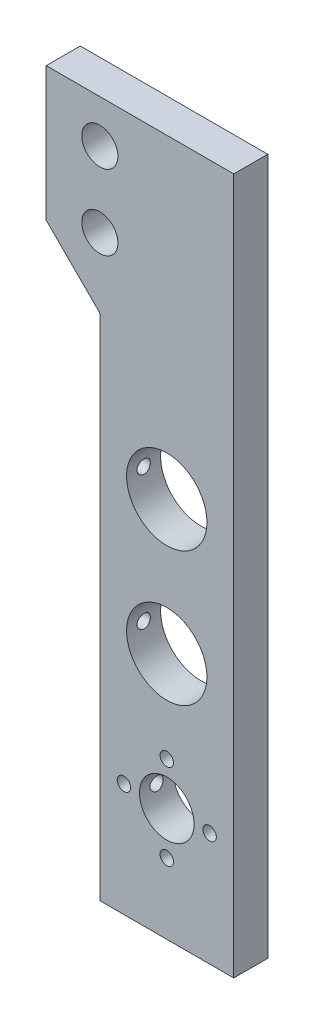
ISO-10303-21;
HEADER;
FILE_DESCRIPTION(('STEP AP214'),'2;1');
FILE_NAME('part.step','',(''),(''),'','','');
FILE_SCHEMA(('AUTOMOTIVE_DESIGN { 1 0 10303 214 1 1 1 1 }'));
ENDSEC;
DATA;
#1=APPLICATION_CONTEXT('core data for automotive mechanical design processes');
#2=APPLICATION_PROTOCOL_DEFINITION('international standard','automotive_design',2000,#1);
#3=PRODUCT_CONTEXT('',#1,'mechanical');
#4=PRODUCT('Part','Part','',(#3));
#5=PRODUCT_RELATED_PRODUCT_CATEGORY('part','',(#4));
#6=PRODUCT_DEFINITION_FORMATION('','',#4);
#7=PRODUCT_DEFINITION_CONTEXT('part definition',#1,'design');
#8=PRODUCT_DEFINITION('design','',#6,#7);
#9=PRODUCT_DEFINITION_SHAPE('','',#8);
#10=(LENGTH_UNIT() NAMED_UNIT(*) SI_UNIT(.MILLI.,.METRE.));
#11=(NAMED_UNIT(*) PLANE_ANGLE_UNIT() SI_UNIT($,.RADIAN.));
#12=(NAMED_UNIT(*) SI_UNIT($,.STERADIAN.) SOLID_ANGLE_UNIT());
#13=UNCERTAINTY_MEASURE_WITH_UNIT(LENGTH_MEASURE(1.E-05),#10,'distance_accuracy_value','');
#14=(GEOMETRIC_REPRESENTATION_CONTEXT(3) GLOBAL_UNCERTAINTY_ASSIGNED_CONTEXT((#13)) GLOBAL_UNIT_ASSIGNED_CONTEXT((#10,
#11,#12)) REPRESENTATION_CONTEXT('',''));
#15=CARTESIAN_POINT('',(0.,0.,0.));
#16=DIRECTION('',(0.,0.,1.));
#17=DIRECTION('',(1.,0.,0.));
#18=AXIS2_PLACEMENT_3D('',#15,#16,#17);
#19=CARTESIAN_POINT('',(0.,0.,6.35));
#20=DIRECTION('',(0.,0.,-1.));
#21=DIRECTION('',(-1.,0.,0.));
#22=AXIS2_PLACEMENT_3D('',#19,#20,#21);
#23=PLANE('',#22);
#24=CARTESIAN_POINT('',(0.,8.,6.35));
#25=DIRECTION('',(0.,0.,1.));
#26=DIRECTION('',(1.,0.,0.));
#27=AXIS2_PLACEMENT_3D('',#24,#25,#26);
#28=CIRCLE('',#27,1.25);
#29=CARTESIAN_POINT('',(1.25,8.,6.35));
#30=VERTEX_POINT('',#29);
#31=EDGE_CURVE('E303',#30,#30,#28,.T.);
#32=ORIENTED_EDGE('',*,*,#31,.F.);
#33=EDGE_LOOP('',(#32));
#34=FACE_BOUND('',#33,.T.);
#35=CARTESIAN_POINT('',(8.,0.,6.35));
#36=DIRECTION('',(0.,0.,1.));
#37=DIRECTION('',(1.,0.,0.));
#38=AXIS2_PLACEMENT_3D('',#35,#36,#37);
#39=CIRCLE('',#38,1.25);
#40=CARTESIAN_POINT('',(9.25,0.,6.35));
#41=VERTEX_POINT('',#40);
#42=EDGE_CURVE('E295',#41,#41,#39,.T.);
#43=ORIENTED_EDGE('',*,*,#42,.F.);
#44=EDGE_LOOP('',(#43));
#45=FACE_BOUND('',#44,.T.);
#46=CARTESIAN_POINT('',(0.,-8.,6.35));
#47=DIRECTION('',(0.,0.,1.));
#48=DIRECTION('',(1.,0.,0.));
#49=AXIS2_PLACEMENT_3D('',#46,#47,#48);
#50=CIRCLE('',#49,1.25);
#51=CARTESIAN_POINT('',(1.25,-8.,6.35));
#52=VERTEX_POINT('',#51);
#53=EDGE_CURVE('E287',#52,#52,#50,.T.);
#54=ORIENTED_EDGE('',*,*,#53,.F.);
#55=EDGE_LOOP('',(#54));
#56=FACE_BOUND('',#55,.T.);
#57=CARTESIAN_POINT('',(-12.5,86.85,6.35));
#58=DIRECTION('',(0.,0.,1.));
#59=DIRECTION('',(1.,0.,0.));
#60=AXIS2_PLACEMENT_3D('',#57,#58,#59);
#61=CIRCLE('',#60,3.3782);
#62=CARTESIAN_POINT('',(-9.1218,86.85,6.35));
#63=VERTEX_POINT('',#62);
#64=EDGE_CURVE('E271',#63,#63,#61,.T.);
#65=ORIENTED_EDGE('',*,*,#64,.F.);
#66=EDGE_LOOP('',(#65));
#67=FACE_BOUND('',#66,.T.);
#68=DIRECTION('',(-1.,0.,0.));
#69=VECTOR('',#68,1.);
#70=CARTESIAN_POINT('',(-12.5,108.85,6.35));
#71=LINE('',#70,#69);
#72=CARTESIAN_POINT('',(12.5,108.85,6.35));
#73=VERTEX_POINT('',#72);
#74=CARTESIAN_POINT('',(-22.5,108.85,6.35));
#75=VERTEX_POINT('',#74);
#76=EDGE_CURVE('E181',#73,#75,#71,.T.);
#77=ORIENTED_EDGE('',*,*,#76,.T.);
#78=DIRECTION('',(0.,-1.,0.));
#79=VECTOR('',#78,1.);
#80=CARTESIAN_POINT('',(-22.5,83.8500000000001,6.35));
#81=LINE('',#80,#79);
#82=CARTESIAN_POINT('',(-22.5,83.8500000000001,6.35));
#83=VERTEX_POINT('',#82);
#84=EDGE_CURVE('E240',#75,#83,#81,.T.);
#85=ORIENTED_EDGE('',*,*,#84,.T.);
#86=DIRECTION('',(0.707106781186543,-0.707106781186552,0.));
#87=VECTOR('',#86,1.);
#88=CARTESIAN_POINT('',(-12.5,73.85,6.35));
#89=LINE('',#88,#87);
#90=CARTESIAN_POINT('',(-12.5,73.85,6.35));
#91=VERTEX_POINT('',#90);
#92=EDGE_CURVE('E237',#83,#91,#89,.T.);
#93=ORIENTED_EDGE('',*,*,#92,.T.);
#94=DIRECTION('',(0.,-1.,0.));
#95=VECTOR('',#94,1.);
#96=CARTESIAN_POINT('',(-12.5,-21.15,6.35));
#97=LINE('',#96,#95);
#98=CARTESIAN_POINT('',(-12.5,-21.15,6.35));
#99=VERTEX_POINT('',#98);
#100=EDGE_CURVE('E185',#91,#99,#97,.T.);
#101=ORIENTED_EDGE('',*,*,#100,.T.);
#102=DIRECTION('',(1.,0.,0.));
#103=VECTOR('',#102,1.);
#104=CARTESIAN_POINT('',(-12.5,-21.15,6.35));
#105=LINE('',#104,#103);
#106=CARTESIAN_POINT('',(12.5,-21.15,6.35));
#107=VERTEX_POINT('',#106);
#108=EDGE_CURVE('E201',#99,#107,#105,.T.);
#109=ORIENTED_EDGE('',*,*,#108,.T.);
#110=DIRECTION('',(0.,1.,0.));
#111=VECTOR('',#110,1.);
#112=CARTESIAN_POINT('',(12.5,-21.15,6.35));
#113=LINE('',#112,#111);
#114=EDGE_CURVE('E198',#107,#73,#113,.T.);
#115=ORIENTED_EDGE('',*,*,#114,.T.);
#116=EDGE_LOOP('',(#77,#85,#93,#101,#109,#115));
#117=FACE_BOUND('',#116,.T.);
#118=CARTESIAN_POINT('',(0.,0.,6.35));
#119=DIRECTION('',(0.,0.,1.));
#120=DIRECTION('',(1.,0.,0.));
#121=AXIS2_PLACEMENT_3D('',#118,#119,#120);
#122=CIRCLE('',#121,5.1);
#123=CARTESIAN_POINT('',(5.1,0.,6.35));
#124=VERTEX_POINT('',#123);
#125=EDGE_CURVE('E195',#124,#124,#122,.T.);
#126=ORIENTED_EDGE('',*,*,#125,.F.);
#127=EDGE_LOOP('',(#126));
#128=FACE_BOUND('',#127,.T.);
#129=CARTESIAN_POINT('',(0.,25.,6.35));
#130=DIRECTION('',(0.,0.,1.));
#131=DIRECTION('',(1.,0.,0.));
#132=AXIS2_PLACEMENT_3D('',#129,#130,#131);
#133=CIRCLE('',#132,7.5);
#134=CARTESIAN_POINT('',(7.5,25.,6.35));
#135=VERTEX_POINT('',#134);
#136=EDGE_CURVE('E210',#135,#135,#133,.T.);
#137=ORIENTED_EDGE('',*,*,#136,.F.);
#138=EDGE_LOOP('',(#137));
#139=FACE_BOUND('',#138,.T.);
#140=CARTESIAN_POINT('',(0.,50.,6.35));
#141=DIRECTION('',(0.,0.,1.));
#142=DIRECTION('',(1.,0.,0.));
#143=AXIS2_PLACEMENT_3D('',#140,#141,#142);
#144=CIRCLE('',#143,7.5);
#145=CARTESIAN_POINT('',(7.5,50.,6.35));
#146=VERTEX_POINT('',#145);
#147=EDGE_CURVE('E218',#146,#146,#144,.T.);
#148=ORIENTED_EDGE('',*,*,#147,.F.);
#149=EDGE_LOOP('',(#148));
#150=FACE_BOUND('',#149,.T.);
#151=CARTESIAN_POINT('',(-12.5,100.85,6.35));
#152=DIRECTION('',(0.,0.,1.));
#153=DIRECTION('',(1.,0.,0.));
#154=AXIS2_PLACEMENT_3D('',#151,#152,#153);
#155=CIRCLE('',#154,3.3782);
#156=CARTESIAN_POINT('',(-9.1218,100.85,6.35));
#157=VERTEX_POINT('',#156);
#158=EDGE_CURVE('E263',#157,#157,#155,.T.);
#159=ORIENTED_EDGE('',*,*,#158,.F.);
#160=EDGE_LOOP('',(#159));
#161=FACE_BOUND('',#160,.T.);
#162=CARTESIAN_POINT('',(-8.,0.,6.35));
#163=DIRECTION('',(0.,0.,1.));
#164=DIRECTION('',(1.,0.,0.));
#165=AXIS2_PLACEMENT_3D('',#162,#163,#164);
#166=CIRCLE('',#165,1.25);
#167=CARTESIAN_POINT('',(-6.75,0.,6.35));
#168=VERTEX_POINT('',#167);
#169=EDGE_CURVE('E279',#168,#168,#166,.T.);
#170=ORIENTED_EDGE('',*,*,#169,.F.);
#171=EDGE_LOOP('',(#170));
#172=FACE_BOUND('',#171,.T.);
#173=ADVANCED_FACE('F45',(#34,#45,#56,#67,#117,#128,#139,#150,#161,#172),#23,.F.);
#174=CARTESIAN_POINT('',(-12.5,0.,3.175));
#175=DIRECTION('',(-1.,0.,0.));
#176=DIRECTION('',(0.,0.,1.));
#177=AXIS2_PLACEMENT_3D('',#174,#175,#176);
#178=CYLINDRICAL_SURFACE('',#177,1.24999999999999);
#179=CARTESIAN_POINT('',(-12.5,0.,3.175));
#180=DIRECTION('',(-1.,0.,0.));
#181=DIRECTION('',(0.,0.,1.));
#182=AXIS2_PLACEMENT_3D('',#179,#180,#181);
#183=CIRCLE('',#182,1.24999999999999);
#184=CARTESIAN_POINT('',(-12.5,0.,4.42499999999999));
#185=VERTEX_POINT('',#184);
#186=EDGE_CURVE('E132',#185,#185,#183,.T.);
#187=ORIENTED_EDGE('',*,*,#186,.T.);
#188=EDGE_LOOP('',(#187));
#189=FACE_BOUND('',#188,.T.);
#190=CARTESIAN_POINT('',(-8.,0.,3.175));
#191=DIRECTION('',(-0.707106781186547,0.,-0.707106781186547));
#192=DIRECTION('',(-0.707106781186547,0.,0.707106781186547));
#193=AXIS2_PLACEMENT_3D('',#190,#191,#192);
#194=ELLIPSE('',#193,1.76776695296636,1.25);
#195=CARTESIAN_POINT('',(-8.,1.25,3.175));
#196=VERTEX_POINT('',#195);
#197=CARTESIAN_POINT('',(-8.,-1.25,3.175));
#198=VERTEX_POINT('',#197);
#199=EDGE_CURVE('E59',#196,#198,#194,.F.);
#200=ORIENTED_EDGE('',*,*,#199,.T.);
#201=CARTESIAN_POINT('',(-8.,0.,3.175));
#202=DIRECTION('',(-0.707106781186547,0.,0.707106781186547));
#203=DIRECTION('',(-0.707106781186547,0.,-0.707106781186547));
#204=AXIS2_PLACEMENT_3D('',#201,#202,#203);
#205=ELLIPSE('',#204,1.76776695296636,1.25);
#206=EDGE_CURVE('E11',#198,#196,#205,.F.);
#207=ORIENTED_EDGE('',*,*,#206,.T.);
#208=EDGE_LOOP('',(#200,#207));
#209=FACE_BOUND('',#208,.T.);
#210=ADVANCED_FACE('F117',(#189,#209),#178,.F.);
#211=CARTESIAN_POINT('',(0.,0.,0.));
#212=DIRECTION('',(0.,0.,-1.));
#213=DIRECTION('',(-1.,0.,0.));
#214=AXIS2_PLACEMENT_3D('',#211,#212,#213);
#215=PLANE('',#214);
#216=CARTESIAN_POINT('',(0.,8.,0.));
#217=DIRECTION('',(0.,0.,1.));
#218=DIRECTION('',(1.,0.,0.));
#219=AXIS2_PLACEMENT_3D('',#216,#217,#218);
#220=CIRCLE('',#219,1.25);
#221=CARTESIAN_POINT('',(1.25,8.,0.));
#222=VERTEX_POINT('',#221);
#223=EDGE_CURVE('E299',#222,#222,#220,.T.);
#224=ORIENTED_EDGE('',*,*,#223,.T.);
#225=EDGE_LOOP('',(#224));
#226=FACE_BOUND('',#225,.T.);
#227=CARTESIAN_POINT('',(8.,0.,0.));
#228=DIRECTION('',(0.,0.,1.));
#229=DIRECTION('',(1.,0.,0.));
#230=AXIS2_PLACEMENT_3D('',#227,#228,#229);
#231=CIRCLE('',#230,1.25);
#232=CARTESIAN_POINT('',(9.25,0.,0.));
#233=VERTEX_POINT('',#232);
#234=EDGE_CURVE('E291',#233,#233,#231,.T.);
#235=ORIENTED_EDGE('',*,*,#234,.T.);
#236=EDGE_LOOP('',(#235));
#237=FACE_BOUND('',#236,.T.);
#238=CARTESIAN_POINT('',(0.,-8.,0.));
#239=DIRECTION('',(0.,0.,1.));
#240=DIRECTION('',(1.,0.,0.));
#241=AXIS2_PLACEMENT_3D('',#238,#239,#240);
#242=CIRCLE('',#241,1.25);
#243=CARTESIAN_POINT('',(1.25,-8.,0.));
#244=VERTEX_POINT('',#243);
#245=EDGE_CURVE('E283',#244,#244,#242,.T.);
#246=ORIENTED_EDGE('',*,*,#245,.T.);
#247=EDGE_LOOP('',(#246));
#248=FACE_BOUND('',#247,.T.);
#249=CARTESIAN_POINT('',(-8.,0.,0.));
#250=DIRECTION('',(0.,0.,1.));
#251=DIRECTION('',(1.,0.,0.));
#252=AXIS2_PLACEMENT_3D('',#249,#250,#251);
#253=CIRCLE('',#252,1.25);
#254=CARTESIAN_POINT('',(-6.75,0.,0.));
#255=VERTEX_POINT('',#254);
#256=EDGE_CURVE('E275',#255,#255,#253,.T.);
#257=ORIENTED_EDGE('',*,*,#256,.T.);
#258=EDGE_LOOP('',(#257));
#259=FACE_BOUND('',#258,.T.);
#260=CARTESIAN_POINT('',(-12.5,86.85,0.));
#261=DIRECTION('',(0.,0.,1.));
#262=DIRECTION('',(1.,0.,0.));
#263=AXIS2_PLACEMENT_3D('',#260,#261,#262);
#264=CIRCLE('',#263,3.3782);
#265=CARTESIAN_POINT('',(-9.1218,86.85,0.));
#266=VERTEX_POINT('',#265);
#267=EDGE_CURVE('E267',#266,#266,#264,.T.);
#268=ORIENTED_EDGE('',*,*,#267,.T.);
#269=EDGE_LOOP('',(#268));
#270=FACE_BOUND('',#269,.T.);
#271=CARTESIAN_POINT('',(-12.5,100.85,0.));
#272=DIRECTION('',(0.,0.,1.));
#273=DIRECTION('',(1.,0.,0.));
#274=AXIS2_PLACEMENT_3D('',#271,#272,#273);
#275=CIRCLE('',#274,3.3782);
#276=CARTESIAN_POINT('',(-9.1218,100.85,0.));
#277=VERTEX_POINT('',#276);
#278=EDGE_CURVE('E257',#277,#277,#275,.T.);
#279=ORIENTED_EDGE('',*,*,#278,.T.);
#280=EDGE_LOOP('',(#279));
#281=FACE_BOUND('',#280,.T.);
#282=CARTESIAN_POINT('',(0.,25.,0.));
#283=DIRECTION('',(0.,0.,1.));
#284=DIRECTION('',(1.,0.,0.));
#285=AXIS2_PLACEMENT_3D('',#282,#283,#284);
#286=CIRCLE('',#285,7.5);
#287=CARTESIAN_POINT('',(7.5,25.,0.));
#288=VERTEX_POINT('',#287);
#289=EDGE_CURVE('E214',#288,#288,#286,.T.);
#290=ORIENTED_EDGE('',*,*,#289,.T.);
#291=EDGE_LOOP('',(#290));
#292=FACE_BOUND('',#291,.T.);
#293=DIRECTION('',(0.,-1.,0.));
#294=VECTOR('',#293,1.);
#295=CARTESIAN_POINT('',(-12.5,-21.15,0.));
#296=LINE('',#295,#294);
#297=CARTESIAN_POINT('',(-12.5,73.85,0.));
#298=VERTEX_POINT('',#297);
#299=CARTESIAN_POINT('',(-12.5,-21.15,0.));
#300=VERTEX_POINT('',#299);
#301=EDGE_CURVE('E192',#298,#300,#296,.T.);
#302=ORIENTED_EDGE('',*,*,#301,.F.);
#303=DIRECTION('',(-0.707106781186543,0.707106781186552,0.));
#304=VECTOR('',#303,1.);
#305=CARTESIAN_POINT('',(-12.5,73.85,0.));
#306=LINE('',#305,#304);
#307=CARTESIAN_POINT('',(-22.5,83.8500000000001,0.));
#308=VERTEX_POINT('',#307);
#309=EDGE_CURVE('E67',#298,#308,#306,.T.);
#310=ORIENTED_EDGE('',*,*,#309,.T.);
#311=DIRECTION('',(0.,1.,0.));
#312=VECTOR('',#311,1.);
#313=CARTESIAN_POINT('',(-22.5,83.8500000000001,0.));
#314=LINE('',#313,#312);
#315=CARTESIAN_POINT('',(-22.5,108.85,0.));
#316=VERTEX_POINT('',#315);
#317=EDGE_CURVE('E245',#308,#316,#314,.T.);
#318=ORIENTED_EDGE('',*,*,#317,.T.);
#319=DIRECTION('',(-1.,0.,0.));
#320=VECTOR('',#319,1.);
#321=CARTESIAN_POINT('',(-12.5,108.85,0.));
#322=LINE('',#321,#320);
#323=CARTESIAN_POINT('',(12.5,108.85,0.));
#324=VERTEX_POINT('',#323);
#325=EDGE_CURVE('E182',#324,#316,#322,.T.);
#326=ORIENTED_EDGE('',*,*,#325,.F.);
#327=DIRECTION('',(0.,1.,0.));
#328=VECTOR('',#327,1.);
#329=CARTESIAN_POINT('',(12.5,-21.15,0.));
#330=LINE('',#329,#328);
#331=CARTESIAN_POINT('',(12.5,-21.15,0.));
#332=VERTEX_POINT('',#331);
#333=EDGE_CURVE('E186',#332,#324,#330,.T.);
#334=ORIENTED_EDGE('',*,*,#333,.F.);
#335=DIRECTION('',(1.,0.,0.));
#336=VECTOR('',#335,1.);
#337=CARTESIAN_POINT('',(-12.5,-21.15,0.));
#338=LINE('',#337,#336);
#339=EDGE_CURVE('E189',#300,#332,#338,.T.);
#340=ORIENTED_EDGE('',*,*,#339,.F.);
#341=EDGE_LOOP('',(#302,#310,#318,#326,#334,#340));
#342=FACE_BOUND('',#341,.T.);
#343=CARTESIAN_POINT('',(0.,0.,0.));
#344=DIRECTION('',(0.,0.,1.));
#345=DIRECTION('',(1.,0.,0.));
#346=AXIS2_PLACEMENT_3D('',#343,#344,#345);
#347=CIRCLE('',#346,5.1);
#348=CARTESIAN_POINT('',(5.1,0.,0.));
#349=VERTEX_POINT('',#348);
#350=EDGE_CURVE('E206',#349,#349,#347,.T.);
#351=ORIENTED_EDGE('',*,*,#350,.T.);
#352=EDGE_LOOP('',(#351));
#353=FACE_BOUND('',#352,.T.);
#354=CARTESIAN_POINT('',(0.,50.,0.));
#355=DIRECTION('',(0.,0.,1.));
#356=DIRECTION('',(1.,0.,0.));
#357=AXIS2_PLACEMENT_3D('',#354,#355,#356);
#358=CIRCLE('',#357,7.5);
#359=CARTESIAN_POINT('',(7.5,50.,0.));
#360=VERTEX_POINT('',#359);
#361=EDGE_CURVE('E168',#360,#360,#358,.T.);
#362=ORIENTED_EDGE('',*,*,#361,.T.);
#363=EDGE_LOOP('',(#362));
#364=FACE_BOUND('',#363,.T.);
#365=ADVANCED_FACE('F365',(#226,#237,#248,#259,#270,#281,#292,#342,#353,#364),#215,.T.);
#366=CARTESIAN_POINT('',(-12.5,-21.15,6.35));
#367=DIRECTION('',(1.,0.,0.));
#368=DIRECTION('',(0.,0.,-1.));
#369=AXIS2_PLACEMENT_3D('',#366,#367,#368);
#370=PLANE('',#369);
#371=ORIENTED_EDGE('',*,*,#186,.F.);
#372=EDGE_LOOP('',(#371));
#373=FACE_BOUND('',#372,.T.);
#374=CARTESIAN_POINT('',(-12.5,25.,3.175));
#375=DIRECTION('',(-1.,0.,0.));
#376=DIRECTION('',(0.,0.,1.));
#377=AXIS2_PLACEMENT_3D('',#374,#375,#376);
#378=CIRCLE('',#377,1.24999999999999);
#379=CARTESIAN_POINT('',(-12.5,25.,4.42499999999999));
#380=VERTEX_POINT('',#379);
#381=EDGE_CURVE('E131',#380,#380,#378,.T.);
#382=ORIENTED_EDGE('',*,*,#381,.F.);
#383=EDGE_LOOP('',(#382));
#384=FACE_BOUND('',#383,.T.);
#385=CARTESIAN_POINT('',(-12.5,50.,3.175));
#386=DIRECTION('',(-1.,0.,0.));
#387=DIRECTION('',(0.,0.,1.));
#388=AXIS2_PLACEMENT_3D('',#385,#386,#387);
#389=CIRCLE('',#388,1.24999999999999);
#390=CARTESIAN_POINT('',(-12.5,50.,4.42499999999999));
#391=VERTEX_POINT('',#390);
#392=EDGE_CURVE('E169',#391,#391,#389,.T.);
#393=ORIENTED_EDGE('',*,*,#392,.F.);
#394=EDGE_LOOP('',(#393));
#395=FACE_BOUND('',#394,.T.);
#396=ORIENTED_EDGE('',*,*,#100,.F.);
#397=DIRECTION('',(0.,0.,-1.));
#398=VECTOR('',#397,1.);
#399=CARTESIAN_POINT('',(-12.5,73.85,42.7505494464026));
#400=LINE('',#399,#398);
#401=EDGE_CURVE('E241',#91,#298,#400,.T.);
#402=ORIENTED_EDGE('',*,*,#401,.T.);
#403=ORIENTED_EDGE('',*,*,#301,.T.);
#404=DIRECTION('',(0.,0.,-1.));
#405=VECTOR('',#404,1.);
#406=CARTESIAN_POINT('',(-12.5,-21.15,6.35));
#407=LINE('',#406,#405);
#408=EDGE_CURVE('E115',#99,#300,#407,.T.);
#409=ORIENTED_EDGE('',*,*,#408,.F.);
#410=EDGE_LOOP('',(#396,#402,#403,#409));
#411=FACE_BOUND('',#410,.T.);
#412=ADVANCED_FACE('F47',(#373,#384,#395,#411),#370,.F.);
#413=CARTESIAN_POINT('',(-12.5,-21.15,6.35));
#414=DIRECTION('',(0.,1.,0.));
#415=DIRECTION('',(-1.,0.,0.));
#416=AXIS2_PLACEMENT_3D('',#413,#414,#415);
#417=PLANE('',#416);
#418=ORIENTED_EDGE('',*,*,#339,.T.);
#419=DIRECTION('',(0.,0.,-1.));
#420=VECTOR('',#419,1.);
#421=CARTESIAN_POINT('',(12.5,-21.15,6.35));
#422=LINE('',#421,#420);
#423=EDGE_CURVE('E173',#107,#332,#422,.T.);
#424=ORIENTED_EDGE('',*,*,#423,.F.);
#425=ORIENTED_EDGE('',*,*,#108,.F.);
#426=ORIENTED_EDGE('',*,*,#408,.T.);
#427=EDGE_LOOP('',(#418,#424,#425,#426));
#428=FACE_BOUND('',#427,.T.);
#429=ADVANCED_FACE('F374',(#428),#417,.F.);
#430=CARTESIAN_POINT('',(12.5,-21.15,6.35));
#431=DIRECTION('',(-1.,0.,0.));
#432=DIRECTION('',(0.,-1.,0.));
#433=AXIS2_PLACEMENT_3D('',#430,#431,#432);
#434=PLANE('',#433);
#435=ORIENTED_EDGE('',*,*,#333,.T.);
#436=DIRECTION('',(0.,0.,-1.));
#437=VECTOR('',#436,1.);
#438=CARTESIAN_POINT('',(12.5,108.85,6.35));
#439=LINE('',#438,#437);
#440=EDGE_CURVE('E177',#73,#324,#439,.T.);
#441=ORIENTED_EDGE('',*,*,#440,.F.);
#442=ORIENTED_EDGE('',*,*,#114,.F.);
#443=ORIENTED_EDGE('',*,*,#423,.T.);
#444=EDGE_LOOP('',(#435,#441,#442,#443));
#445=FACE_BOUND('',#444,.T.);
#446=ADVANCED_FACE('F377',(#445),#434,.F.);
#447=CARTESIAN_POINT('',(-12.5,108.85,6.35));
#448=DIRECTION('',(0.,-1.,0.));
#449=DIRECTION('',(0.,0.,-1.));
#450=AXIS2_PLACEMENT_3D('',#447,#448,#449);
#451=PLANE('',#450);
#452=ORIENTED_EDGE('',*,*,#325,.T.);
#453=DIRECTION('',(0.,0.,-1.));
#454=VECTOR('',#453,1.);
#455=CARTESIAN_POINT('',(-22.5,108.85,42.7505494464026));
#456=LINE('',#455,#454);
#457=EDGE_CURVE('E248',#75,#316,#456,.T.);
#458=ORIENTED_EDGE('',*,*,#457,.F.);
#459=ORIENTED_EDGE('',*,*,#76,.F.);
#460=ORIENTED_EDGE('',*,*,#440,.T.);
#461=EDGE_LOOP('',(#452,#458,#459,#460));
#462=FACE_BOUND('',#461,.T.);
#463=ADVANCED_FACE('F359',(#462),#451,.F.);
#464=CARTESIAN_POINT('',(0.,0.,6.35));
#465=DIRECTION('',(0.,0.,-1.));
#466=DIRECTION('',(-1.,0.,0.));
#467=AXIS2_PLACEMENT_3D('',#464,#465,#466);
#468=CYLINDRICAL_SURFACE('',#467,5.1);
#469=CARTESIAN_POINT('',(-5.1,0.,4.42499999999999));
#470=CARTESIAN_POINT('',(-5.09999880434979,-0.0691070684996923,4.42499798348911));
#471=CARTESIAN_POINT('',(-5.09858131536654,-0.138236944418446,4.4192497622837));
#472=CARTESIAN_POINT('',(-5.09306394414274,-0.27451832854268,4.39644143704133));
#473=CARTESIAN_POINT('',(-5.08896247642349,-0.341668642864989,4.37937464682424));
#474=CARTESIAN_POINT('',(-5.07853173481307,-0.472002952228089,4.33450744461656));
#475=CARTESIAN_POINT('',(-5.07220508043732,-0.5351915084831,4.30671964980311));
#476=CARTESIAN_POINT('',(-5.0579992354546,-0.656009783807283,4.24124292525055));
#477=CARTESIAN_POINT('',(-5.05012000732641,-0.713639368482087,4.2035537562166));
#478=CARTESIAN_POINT('',(-5.03349079831523,-0.822848252966835,4.11855356167071));
#479=CARTESIAN_POINT('',(-5.02472780422834,-0.874301457474932,4.07108306460641));
#480=CARTESIAN_POINT('',(-5.00740600303306,-0.968601490513414,3.96820930927441));
#481=CARTESIAN_POINT('',(-4.99884721820992,-1.01144738348376,3.91280518979219));
#482=CARTESIAN_POINT('',(-4.98277220490616,-1.0879035028578,3.7946655484121));
#483=CARTESIAN_POINT('',(-4.9752725239875,-1.1213738013313,3.73183701406763));
#484=CARTESIAN_POINT('',(-4.96235417524496,-1.17722916418204,3.60123185816075));
#485=CARTESIAN_POINT('',(-4.95693518890104,-1.1996159254181,3.53345599584475));
#486=CARTESIAN_POINT('',(-4.94892534918552,-1.23224077227211,3.39626367528794));
#487=CARTESIAN_POINT('',(-4.94628192270404,-1.24270502580645,3.32690414045871));
#488=CARTESIAN_POINT('',(-4.94396505119134,-1.2518920997985,3.18736752907348));
#489=CARTESIAN_POINT('',(-4.94429114286616,-1.25061675182797,3.11719058175357));
#490=CARTESIAN_POINT('',(-4.94782914866117,-1.23654152995141,2.97973582774668));
#491=CARTESIAN_POINT('',(-4.9509738595344,-1.22401001756151,2.91242854252081));
#492=CARTESIAN_POINT('',(-4.95968781619626,-1.18820580162089,2.78090195017533));
#493=CARTESIAN_POINT('',(-4.96525722871731,-1.1649323594044,2.71668285574965));
#494=CARTESIAN_POINT('',(-4.97825548132943,-1.10807335491485,2.5924302741977));
#495=CARTESIAN_POINT('',(-4.98570192341189,-1.07438945055791,2.53244370782828));
#496=CARTESIAN_POINT('',(-5.00160513396375,-0.997734518212738,2.41887753755934));
#497=CARTESIAN_POINT('',(-5.01006207277567,-0.954761923411034,2.3652990169383));
#498=CARTESIAN_POINT('',(-5.02731725106061,-0.859354317594715,2.26453072281943));
#499=CARTESIAN_POINT('',(-5.03611849726846,-0.80669254516649,2.21755590209154));
#500=CARTESIAN_POINT('',(-5.05286158733432,-0.69413417805451,2.13306440738741));
#501=CARTESIAN_POINT('',(-5.06080340690474,-0.634237379008398,2.09554800066832));
#502=CARTESIAN_POINT('',(-5.07496988361232,-0.508609859612946,2.03096369665686));
#503=CARTESIAN_POINT('',(-5.08118896830561,-0.442861095774586,2.00392959578838));
#504=CARTESIAN_POINT('',(-5.09116862078237,-0.307566171137273,1.96135681179118));
#505=CARTESIAN_POINT('',(-5.09492964005615,-0.238020710248732,1.94581601753633));
#506=CARTESIAN_POINT('',(-5.09950300203926,-0.098945314274633,1.92699667883518));
#507=CARTESIAN_POINT('',(-5.10038575477826,-0.0294572667514421,1.92342526946549));
#508=CARTESIAN_POINT('',(-5.09930312829893,0.109123373763241,1.92784439063548));
#509=CARTESIAN_POINT('',(-5.09733799487026,0.178216000365266,1.93583392339636));
#510=CARTESIAN_POINT('',(-5.09082541313749,0.313034626367913,1.96290645272339));
#511=CARTESIAN_POINT('',(-5.08631494103106,0.378794452619993,1.9818306926693));
#512=CARTESIAN_POINT('',(-5.07521932825952,0.506203454443046,2.03005495923954));
#513=CARTESIAN_POINT('',(-5.06863398290122,0.567852223717139,2.05935600960629));
#514=CARTESIAN_POINT('',(-5.05394953642363,0.686461955962982,2.12807669338878));
#515=CARTESIAN_POINT('',(-5.04582634854577,0.74332405912619,2.16766168645971));
#516=CARTESIAN_POINT('',(-5.02900694161717,0.849702675725454,2.25561419666595));
#517=CARTESIAN_POINT('',(-5.02031062787397,0.899217970897997,2.30398316742856));
#518=CARTESIAN_POINT('',(-5.00307328773869,0.990696382723894,2.40948809131636));
#519=CARTESIAN_POINT('',(-4.99454072619954,1.03245444963732,2.46680350705719));
#520=CARTESIAN_POINT('',(-4.9788261359557,1.10575822346969,2.58780212648628));
#521=CARTESIAN_POINT('',(-4.97164404691533,1.13730438667597,2.65148504549588));
#522=CARTESIAN_POINT('',(-4.95952136957446,1.18905616976229,2.78306601778779));
#523=CARTESIAN_POINT('',(-4.95456754355924,1.20932893763628,2.85093637844542));
#524=CARTESIAN_POINT('',(-4.94744732527486,1.2381394598066,2.98926126330338));
#525=CARTESIAN_POINT('',(-4.94528035148441,1.24667966231571,3.05971524523299));
#526=CARTESIAN_POINT('',(-4.94402228162178,1.25165848529287,3.19912423175996));
#527=CARTESIAN_POINT('',(-4.94484800382851,1.2484243607539,3.26806698903094));
#528=CARTESIAN_POINT('',(-4.94929065899866,1.23069244506029,3.40439209851615));
#529=CARTESIAN_POINT('',(-4.952907540025,1.21619486349272,3.47177447974137));
#530=CARTESIAN_POINT('',(-4.96247954352293,1.17652305640476,3.60272609531758));
#531=CARTESIAN_POINT('',(-4.9684217046624,1.1514079526715,3.66631425279892));
#532=CARTESIAN_POINT('',(-4.98197703107667,1.09126121671283,3.78841874530863));
#533=CARTESIAN_POINT('',(-4.98959041906046,1.05622826264648,3.84693440292061));
#534=CARTESIAN_POINT('',(-5.00586943046763,0.976204563183662,3.95881959942418));
#535=CARTESIAN_POINT('',(-5.01455668828479,0.930985706061677,4.0120228663445));
#536=CARTESIAN_POINT('',(-5.03187294207899,0.832321323332238,4.1101927865744));
#537=CARTESIAN_POINT('',(-5.04050192381697,0.778873858036758,4.15515749236229));
#538=CARTESIAN_POINT('',(-5.05690655619084,0.664158652901532,4.23632692040344));
#539=CARTESIAN_POINT('',(-5.0646649532915,0.602772094361998,4.27236745852572));
#540=CARTESIAN_POINT('',(-5.07827391506525,0.474628080310967,4.3335600387649));
#541=CARTESIAN_POINT('',(-5.08412588542531,0.407874627519969,4.35872010800248));
#542=CARTESIAN_POINT('',(-5.09236742668302,0.284339168519939,4.39357703254263));
#543=CARTESIAN_POINT('',(-5.09521030945108,0.228160130166595,4.40533568875331));
#544=CARTESIAN_POINT('',(-5.09902702732158,0.114659241633676,4.42104773842207));
#545=CARTESIAN_POINT('',(-5.10000099201949,0.0573374709725586,4.4250016730797));
#546=CARTESIAN_POINT('',(-5.1,0.,4.42499999999999));
#547=B_SPLINE_CURVE_WITH_KNOTS('',3,(#469,#470,#471,#472,#473,#474,#475,#476,#477,#478,#479,
#480,#481,#482,#483,#484,#485,#486,#487,#488,#489,#490,#491,#492,#493,#494,#495,#496,#497,#498,
#499,#500,#501,#502,#503,#504,#505,#506,#507,#508,#509,#510,#511,#512,#513,#514,#515,#516,#517,
#518,#519,#520,#521,#522,#523,#524,#525,#526,#527,#528,#529,#530,#531,#532,#533,#534,#535,#536,
#537,#538,#539,#540,#541,#542,#543,#544,#545,#546),.UNSPECIFIED.,.T.,.F.,(4,2,2,2,2,2,2,2,2,2,2,
2,2,2,2,2,2,2,2,2,2,2,2,2,2,2,2,2,2,2,2,2,2,2,2,2,2,2,4),(0.,0.207111126001138,
0.414344707167138,0.621335142633985,0.828330581073004,1.03901413705267,1.24972058061969,
1.46342191841654,1.67709052900646,1.88663462873631,2.0961460366792,2.30079124414466,
2.50545052607677,2.7121054715303,2.91879530271745,3.13114126306258,3.34349322278759,
3.55652425234778,3.76951614198415,3.97725697741622,4.18497988463468,4.38976012844556,
4.59456058084083,4.80288334137087,5.01124060791516,5.22449909344889,5.43774804887088,
5.64971283372676,5.86163338156038,6.06770935164207,6.27378148721515,6.47872095452593,
6.68368774882845,6.89380526695207,7.10397239106228,7.31775867260688,7.53138696205183,
7.7032369909711,7.87507510294711),.UNSPECIFIED.);
#548=CARTESIAN_POINT('',(-5.1,0.,4.42499999999999));
#549=VERTEX_POINT('',#548);
#550=EDGE_CURVE('E122',#549,#549,#547,.T.);
#551=ORIENTED_EDGE('',*,*,#550,.F.);
#552=EDGE_LOOP('',(#551));
#553=FACE_BOUND('',#552,.T.);
#554=ORIENTED_EDGE('',*,*,#125,.T.);
#555=EDGE_LOOP('',(#554));
#556=FACE_BOUND('',#555,.T.);
#557=ORIENTED_EDGE('',*,*,#350,.F.);
#558=EDGE_LOOP('',(#557));
#559=FACE_BOUND('',#558,.T.);
#560=ADVANCED_FACE('F140',(#553,#556,#559),#468,.F.);
#561=CARTESIAN_POINT('',(0.,25.,6.35));
#562=DIRECTION('',(0.,0.,-1.));
#563=DIRECTION('',(-1.,0.,0.));
#564=AXIS2_PLACEMENT_3D('',#561,#562,#563);
#565=CYLINDRICAL_SURFACE('',#564,7.5);
#566=CARTESIAN_POINT('',(-7.5,25.,4.42499999999999));
#567=CARTESIAN_POINT('',(-7.49999880584412,24.9303045475209,4.42499720552608));
#568=CARTESIAN_POINT('',(-7.49901838956517,24.8605710590806,4.41915136251553));
#569=CARTESIAN_POINT('',(-7.49520172470694,24.7230598891635,4.39593217061733));
#570=CARTESIAN_POINT('',(-7.49236376961945,24.6552840660204,4.37854822154419));
#571=CARTESIAN_POINT('',(-7.48515034118225,24.5236976263937,4.33279227570361));
#572=CARTESIAN_POINT('',(-7.48077612579596,24.459883815784,4.3044292671797));
#573=CARTESIAN_POINT('',(-7.47097113541035,24.337929079011,4.23754385397379));
#574=CARTESIAN_POINT('',(-7.46554048127217,24.2797875050607,4.19902261125849));
#575=CARTESIAN_POINT('',(-7.45416658729156,24.1702636928542,4.11252245808976));
#576=CARTESIAN_POINT('',(-7.44821935907428,24.1189435482325,4.06446544268193));
#577=CARTESIAN_POINT('',(-7.43651313438366,24.02505575067,3.96042601576359));
#578=CARTESIAN_POINT('',(-7.43075414981334,23.9824886503045,3.90444310427169));
#579=CARTESIAN_POINT('',(-7.4200378287989,23.9070664371974,3.78571451690147));
#580=CARTESIAN_POINT('',(-7.41508564545818,23.8742727235695,3.72292933159762));
#581=CARTESIAN_POINT('',(-7.40659894897337,23.8197208172944,3.59264521784968));
#582=CARTESIAN_POINT('',(-7.40306434007154,23.7979618792172,3.52514660816118));
#583=CARTESIAN_POINT('',(-7.39785268421378,23.7662928111076,3.38800986257172));
#584=CARTESIAN_POINT('',(-7.3961588424285,23.7562754854323,3.3183971317493));
#585=CARTESIAN_POINT('',(-7.39476969468325,23.7480416373551,3.17845986155826));
#586=CARTESIAN_POINT('',(-7.39507424728607,23.7498242798055,3.10813537291635));
#587=CARTESIAN_POINT('',(-7.39763214431778,23.7650524508019,2.96953606936227));
#588=CARTESIAN_POINT('',(-7.39986536659458,23.7783775590551,2.90124759822738));
#589=CARTESIAN_POINT('',(-7.40599747605504,23.8161234297983,2.76788934108543));
#590=CARTESIAN_POINT('',(-7.40989642036636,23.8405445728401,2.70281966555573));
#591=CARTESIAN_POINT('',(-7.4189423966705,23.8999113769531,2.57738558827954));
#592=CARTESIAN_POINT('',(-7.42409533553663,23.9349070430602,2.51704529695939));
#593=CARTESIAN_POINT('',(-7.43506459207504,24.0143939912213,2.40304779973081));
#594=CARTESIAN_POINT('',(-7.44088096327143,24.0588860396729,2.34939113377254));
#595=CARTESIAN_POINT('',(-7.45261013939893,24.1567588939205,2.24958695709633));
#596=CARTESIAN_POINT('',(-7.45852324615826,24.2102430180634,2.20354074072996));
#597=CARTESIAN_POINT('',(-7.46971300698362,24.3242323755092,2.12106111866733));
#598=CARTESIAN_POINT('',(-7.47498965694873,24.3847376540468,2.08462777490839));
#599=CARTESIAN_POINT('',(-7.48431946446456,24.5111470419167,2.02239888643186));
#600=CARTESIAN_POINT('',(-7.48837159203724,24.5770556372177,1.99661229033438));
#601=CARTESIAN_POINT('',(-7.4947875150633,24.7123508271986,1.95650289237702));
#602=CARTESIAN_POINT('',(-7.49715145175237,24.7817371304103,1.94217913151315));
#603=CARTESIAN_POINT('',(-7.49990564921343,24.9211450493492,1.92553932076944));
#604=CARTESIAN_POINT('',(-7.50031876506392,24.9911496314245,1.92308421409721));
#605=CARTESIAN_POINT('',(-7.49918737210585,25.1305698864449,1.92988067221407));
#606=CARTESIAN_POINT('',(-7.49764293862059,25.199985581946,1.93913178656688));
#607=CARTESIAN_POINT('',(-7.49278413469101,25.3358280877734,1.96896242466775));
#608=CARTESIAN_POINT('',(-7.48948052400655,25.4022704341927,1.98947310419507));
#609=CARTESIAN_POINT('',(-7.48147232227679,25.5307734424302,2.04116725909978));
#610=CARTESIAN_POINT('',(-7.4767676525601,25.5928338579549,2.07235133381764));
#611=CARTESIAN_POINT('',(-7.46642258151204,25.7114153447345,2.1448255623484));
#612=CARTESIAN_POINT('',(-7.46077427943511,25.7678826254686,2.18620257808364));
#613=CARTESIAN_POINT('',(-7.4491923369595,25.8731217927513,2.27776865769254));
#614=CARTESIAN_POINT('',(-7.44325867585773,25.9218931198483,2.32795836163834));
#615=CARTESIAN_POINT('',(-7.43170087617923,26.010871389829,2.43634877403572));
#616=CARTESIAN_POINT('',(-7.42608058068553,26.0509843805569,2.49462708275721));
#617=CARTESIAN_POINT('',(-7.41585764888942,26.1208511551475,2.61717648456928));
#618=CARTESIAN_POINT('',(-7.4112549803301,26.1506052673849,2.68144738761376));
#619=CARTESIAN_POINT('',(-7.40361726848852,26.1987691657366,2.81389486640607));
#620=CARTESIAN_POINT('',(-7.40057577155532,26.217225716274,2.88205404751525));
#621=CARTESIAN_POINT('',(-7.39638858417631,26.2424177268891,3.02056006461089));
#622=CARTESIAN_POINT('',(-7.39524272891361,26.2491542059731,3.09090670986603));
#623=CARTESIAN_POINT('',(-7.39498366542006,26.2506864330237,3.23085258298121));
#624=CARTESIAN_POINT('',(-7.39584528252825,26.2456300680626,3.30045018928765));
#625=CARTESIAN_POINT('',(-7.39944890726864,26.2240399194784,3.43778962402539));
#626=CARTESIAN_POINT('',(-7.40219090880607,26.2075061730562,3.50553145847094));
#627=CARTESIAN_POINT('',(-7.4092367814086,26.1634872447974,3.63717921864631));
#628=CARTESIAN_POINT('',(-7.41353883609835,26.1360147953002,3.70108950502801));
#629=CARTESIAN_POINT('',(-7.42322184461104,26.0709135019579,3.82341783459742));
#630=CARTESIAN_POINT('',(-7.428602851942,26.0332841543743,3.88183560518607));
#631=CARTESIAN_POINT('',(-7.43991727022811,25.9484094421861,3.99226779155387));
#632=CARTESIAN_POINT('',(-7.44585647788151,25.9010552817968,4.04419800835013));
#633=CARTESIAN_POINT('',(-7.45757186180421,25.7983045156901,4.13942580223746));
#634=CARTESIAN_POINT('',(-7.46334800013273,25.7429060564563,4.18272138431908));
#635=CARTESIAN_POINT('',(-7.4741326482111,25.6251845848201,4.25972413409997));
#636=CARTESIAN_POINT('',(-7.47913558126552,25.5628163937664,4.29336301965647));
#637=CARTESIAN_POINT('',(-7.48775583800888,25.4332565346895,4.34963474230495));
#638=CARTESIAN_POINT('',(-7.49137454088741,25.366069747415,4.37227854053984));
#639=CARTESIAN_POINT('',(-7.49602895416478,25.2488516550227,4.40100263706332));
#640=CARTESIAN_POINT('',(-7.49751013636679,25.1995294151492,4.40998723480797));
#641=CARTESIAN_POINT('',(-7.4994960799306,25.1001446551599,4.42198686892237));
#642=CARTESIAN_POINT('',(-7.50000085810321,25.0500821478042,4.42500200806867));
#643=CARTESIAN_POINT('',(-7.5,25.,4.42499999999999));
#644=B_SPLINE_CURVE_WITH_KNOTS('',3,(#566,#567,#568,#569,#570,#571,#572,#573,#574,#575,#576,
#577,#578,#579,#580,#581,#582,#583,#584,#585,#586,#587,#588,#589,#590,#591,#592,#593,#594,#595,
#596,#597,#598,#599,#600,#601,#602,#603,#604,#605,#606,#607,#608,#609,#610,#611,#612,#613,#614,
#615,#616,#617,#618,#619,#620,#621,#622,#623,#624,#625,#626,#627,#628,#629,#630,#631,#632,#633,
#634,#635,#636,#637,#638,#639,#640,#641,#642,#643),.UNSPECIFIED.,.T.,.F.,(4,2,2,2,2,2,2,2,2,2,2,
2,2,2,2,2,2,2,2,2,2,2,2,2,2,2,2,2,2,2,2,2,2,2,2,2,2,2,4),(0.,0.208903292469255,0.41799877284771,
0.626923433512637,0.835824206337394,1.04651245531165,1.25721400084928,1.46921260411919,
1.6811968843809,1.89123038551711,2.10124902160442,2.30910260880203,2.51696332512689,
2.72582278316277,2.93469910340285,3.14616384955662,3.35762995817922,3.56927344457949,
3.78089922260572,3.99003941745696,4.19917156517927,4.40703903503205,4.6149181791303,
4.82463412813509,5.03436531527138,5.24626911003806,5.45816618687968,5.66918011170882,
5.88017568893305,6.08853954761346,6.29690273094062,6.50502409113107,6.71315577514663,
6.92375692096691,7.13440666939481,7.34651115803595,7.55840376065031,7.70852124082004,
7.85863613638478),.UNSPECIFIED.);
#645=CARTESIAN_POINT('',(-7.5,25.,4.42499999999999));
#646=VERTEX_POINT('',#645);
#647=EDGE_CURVE('E133',#646,#646,#644,.T.);
#648=ORIENTED_EDGE('',*,*,#647,.F.);
#649=EDGE_LOOP('',(#648));
#650=FACE_BOUND('',#649,.T.);
#651=ORIENTED_EDGE('',*,*,#136,.T.);
#652=EDGE_LOOP('',(#651));
#653=FACE_BOUND('',#652,.T.);
#654=ORIENTED_EDGE('',*,*,#289,.F.);
#655=EDGE_LOOP('',(#654));
#656=FACE_BOUND('',#655,.T.);
#657=ADVANCED_FACE('F408',(#650,#653,#656),#565,.F.);
#658=CARTESIAN_POINT('',(0.,50.,6.35));
#659=DIRECTION('',(0.,0.,-1.));
#660=DIRECTION('',(-1.,0.,0.));
#661=AXIS2_PLACEMENT_3D('',#658,#659,#660);
#662=CYLINDRICAL_SURFACE('',#661,7.5);
#663=CARTESIAN_POINT('',(-7.5,50.,4.42499999999999));
#664=CARTESIAN_POINT('',(-7.49999880584412,49.9303045475209,4.42499720552608));
#665=CARTESIAN_POINT('',(-7.49901838956517,49.8605710590806,4.41915136251553));
#666=CARTESIAN_POINT('',(-7.49520172470694,49.7230598891635,4.39593217061733));
#667=CARTESIAN_POINT('',(-7.49236376961945,49.6552840660204,4.37854822154419));
#668=CARTESIAN_POINT('',(-7.48515034118225,49.5236976263937,4.33279227570361));
#669=CARTESIAN_POINT('',(-7.48077612579596,49.459883815784,4.3044292671797));
#670=CARTESIAN_POINT('',(-7.47097113541035,49.337929079011,4.23754385397379));
#671=CARTESIAN_POINT('',(-7.46554048127217,49.2797875050607,4.19902261125849));
#672=CARTESIAN_POINT('',(-7.45416658729156,49.1702636928542,4.11252245808976));
#673=CARTESIAN_POINT('',(-7.44821935907428,49.1189435482325,4.06446544268193));
#674=CARTESIAN_POINT('',(-7.43651313438366,49.02505575067,3.96042601576358));
#675=CARTESIAN_POINT('',(-7.43075414981334,48.9824886503045,3.90444310427168));
#676=CARTESIAN_POINT('',(-7.4200378287989,48.9070664371974,3.78571451690146));
#677=CARTESIAN_POINT('',(-7.41508564545818,48.8742727235695,3.72292933159761));
#678=CARTESIAN_POINT('',(-7.40659894897337,48.8197208172944,3.59264521784968));
#679=CARTESIAN_POINT('',(-7.40306434007154,48.7979618792172,3.52514660816118));
#680=CARTESIAN_POINT('',(-7.39785268421378,48.7662928111076,3.38800986257172));
#681=CARTESIAN_POINT('',(-7.3961588424285,48.7562754854323,3.3183971317493));
#682=CARTESIAN_POINT('',(-7.39476969468325,48.7480416373551,3.17845986155826));
#683=CARTESIAN_POINT('',(-7.39507424728607,48.7498242798055,3.10813537291635));
#684=CARTESIAN_POINT('',(-7.39763214431778,48.7650524508019,2.96953606936227));
#685=CARTESIAN_POINT('',(-7.39986536659459,48.7783775590551,2.90124759822738));
#686=CARTESIAN_POINT('',(-7.40599747605504,48.8161234297983,2.76788934108543));
#687=CARTESIAN_POINT('',(-7.40989642036636,48.8405445728401,2.70281966555573));
#688=CARTESIAN_POINT('',(-7.4189423966705,48.8999113769531,2.57738558827954));
#689=CARTESIAN_POINT('',(-7.42409533553663,48.9349070430602,2.51704529695939));
#690=CARTESIAN_POINT('',(-7.43506459207505,49.0143939912213,2.40304779973081));
#691=CARTESIAN_POINT('',(-7.44088096327143,49.0588860396729,2.34939113377254));
#692=CARTESIAN_POINT('',(-7.45261013939893,49.1567588939205,2.24958695709633));
#693=CARTESIAN_POINT('',(-7.45852324615826,49.2102430180634,2.20354074072997));
#694=CARTESIAN_POINT('',(-7.46971300698362,49.3242323755092,2.12106111866734));
#695=CARTESIAN_POINT('',(-7.47498965694873,49.3847376540468,2.08462777490839));
#696=CARTESIAN_POINT('',(-7.48431946446456,49.5111470419167,2.02239888643187));
#697=CARTESIAN_POINT('',(-7.48837159203724,49.5770556372177,1.99661229033438));
#698=CARTESIAN_POINT('',(-7.4947875150633,49.7123508271986,1.95650289237702));
#699=CARTESIAN_POINT('',(-7.49715145175237,49.7817371304103,1.94217913151315));
#700=CARTESIAN_POINT('',(-7.49990564921343,49.9211450493492,1.92553932076944));
#701=CARTESIAN_POINT('',(-7.50031876506392,49.9911496314245,1.92308421409721));
#702=CARTESIAN_POINT('',(-7.49918737210585,50.1305698864449,1.92988067221407));
#703=CARTESIAN_POINT('',(-7.49764293862059,50.199985581946,1.93913178656688));
#704=CARTESIAN_POINT('',(-7.49278413469101,50.3358280877734,1.96896242466775));
#705=CARTESIAN_POINT('',(-7.48948052400655,50.4022704341927,1.98947310419507));
#706=CARTESIAN_POINT('',(-7.48147232227679,50.5307734424302,2.04116725909978));
#707=CARTESIAN_POINT('',(-7.4767676525601,50.5928338579549,2.07235133381765));
#708=CARTESIAN_POINT('',(-7.46642258151204,50.7114153447345,2.1448255623484));
#709=CARTESIAN_POINT('',(-7.46077427943511,50.7678826254686,2.18620257808363));
#710=CARTESIAN_POINT('',(-7.4491923369595,50.8731217927513,2.27776865769254));
#711=CARTESIAN_POINT('',(-7.44325867585773,50.9218931198483,2.32795836163834));
#712=CARTESIAN_POINT('',(-7.43170087617923,51.010871389829,2.43634877403572));
#713=CARTESIAN_POINT('',(-7.42608058068553,51.0509843805569,2.49462708275721));
#714=CARTESIAN_POINT('',(-7.41585764888942,51.1208511551475,2.61717648456928));
#715=CARTESIAN_POINT('',(-7.4112549803301,51.1506052673849,2.68144738761375));
#716=CARTESIAN_POINT('',(-7.40361726848852,51.1987691657366,2.81389486640607));
#717=CARTESIAN_POINT('',(-7.40057577155532,51.217225716274,2.88205404751525));
#718=CARTESIAN_POINT('',(-7.39638858417631,51.2424177268891,3.02056006461089));
#719=CARTESIAN_POINT('',(-7.39524272891361,51.2491542059731,3.09090670986603));
#720=CARTESIAN_POINT('',(-7.39498366542006,51.2506864330237,3.23085258298121));
#721=CARTESIAN_POINT('',(-7.39584528252825,51.2456300680626,3.30045018928765));
#722=CARTESIAN_POINT('',(-7.39944890726864,51.2240399194784,3.43778962402539));
#723=CARTESIAN_POINT('',(-7.40219090880607,51.2075061730562,3.50553145847094));
#724=CARTESIAN_POINT('',(-7.40923678140859,51.1634872447974,3.63717921864631));
#725=CARTESIAN_POINT('',(-7.41353883609835,51.1360147953002,3.70108950502801));
#726=CARTESIAN_POINT('',(-7.42322184461104,51.0709135019579,3.82341783459742));
#727=CARTESIAN_POINT('',(-7.428602851942,51.0332841543743,3.88183560518607));
#728=CARTESIAN_POINT('',(-7.43991727022811,50.9484094421861,3.99226779155388));
#729=CARTESIAN_POINT('',(-7.44585647788151,50.9010552817968,4.04419800835014));
#730=CARTESIAN_POINT('',(-7.45757186180421,50.7983045156901,4.13942580223746));
#731=CARTESIAN_POINT('',(-7.46334800013273,50.7429060564563,4.18272138431908));
#732=CARTESIAN_POINT('',(-7.4741326482111,50.6251845848201,4.25972413409997));
#733=CARTESIAN_POINT('',(-7.47913558126552,50.5628163937664,4.29336301965647));
#734=CARTESIAN_POINT('',(-7.48775583800888,50.4332565346895,4.34963474230495));
#735=CARTESIAN_POINT('',(-7.49137454088741,50.366069747415,4.37227854053984));
#736=CARTESIAN_POINT('',(-7.49602895416478,50.2488516550227,4.40100263706332));
#737=CARTESIAN_POINT('',(-7.49751013636679,50.1995294151492,4.40998723480797));
#738=CARTESIAN_POINT('',(-7.4994960799306,50.1001446551599,4.42198686892237));
#739=CARTESIAN_POINT('',(-7.50000085810321,50.0500821478043,4.42500200806867));
#740=CARTESIAN_POINT('',(-7.5,50.,4.42499999999999));
#741=B_SPLINE_CURVE_WITH_KNOTS('',3,(#663,#664,#665,#666,#667,#668,#669,#670,#671,#672,#673,
#674,#675,#676,#677,#678,#679,#680,#681,#682,#683,#684,#685,#686,#687,#688,#689,#690,#691,#692,
#693,#694,#695,#696,#697,#698,#699,#700,#701,#702,#703,#704,#705,#706,#707,#708,#709,#710,#711,
#712,#713,#714,#715,#716,#717,#718,#719,#720,#721,#722,#723,#724,#725,#726,#727,#728,#729,#730,
#731,#732,#733,#734,#735,#736,#737,#738,#739,#740),.UNSPECIFIED.,.T.,.F.,(4,2,2,2,2,2,2,2,2,2,2,
2,2,2,2,2,2,2,2,2,2,2,2,2,2,2,2,2,2,2,2,2,2,2,2,2,2,2,4),(0.,0.208903292469259,0.41799877284771,
0.62692343351264,0.835824206337389,1.04651245531166,1.25721400084928,1.4692126041192,
1.6811968843809,1.89123038551711,2.10124902160442,2.30910260880203,2.51696332512689,
2.72582278316278,2.93469910340285,3.1461638495566,3.35762995817922,3.56927344457949,
3.78089922260572,3.99003941745695,4.19917156517927,4.40703903503205,4.6149181791303,
4.82463412813508,5.03436531527138,5.24626911003806,5.45816618687968,5.66918011170882,
5.88017568893305,6.08853954761346,6.29690273094062,6.50502409113107,6.71315577514664,
6.92375692096691,7.13440666939481,7.34651115803595,7.5584037606503,7.70852124082003,
7.85863613638478),.UNSPECIFIED.);
#742=CARTESIAN_POINT('',(-7.5,50.,4.42499999999999));
#743=VERTEX_POINT('',#742);
#744=EDGE_CURVE('E161',#743,#743,#741,.T.);
#745=ORIENTED_EDGE('',*,*,#744,.F.);
#746=EDGE_LOOP('',(#745));
#747=FACE_BOUND('',#746,.T.);
#748=ORIENTED_EDGE('',*,*,#147,.T.);
#749=EDGE_LOOP('',(#748));
#750=FACE_BOUND('',#749,.T.);
#751=ORIENTED_EDGE('',*,*,#361,.F.);
#752=EDGE_LOOP('',(#751));
#753=FACE_BOUND('',#752,.T.);
#754=ADVANCED_FACE('F158',(#747,#750,#753),#662,.F.);
#755=CARTESIAN_POINT('',(-12.5,50.,3.175));
#756=DIRECTION('',(-1.,0.,0.));
#757=DIRECTION('',(0.,0.,1.));
#758=AXIS2_PLACEMENT_3D('',#755,#756,#757);
#759=CYLINDRICAL_SURFACE('',#758,1.24999999999999);
#760=ORIENTED_EDGE('',*,*,#744,.T.);
#761=EDGE_LOOP('',(#760));
#762=FACE_BOUND('',#761,.T.);
#763=ORIENTED_EDGE('',*,*,#392,.T.);
#764=EDGE_LOOP('',(#763));
#765=FACE_BOUND('',#764,.T.);
#766=ADVANCED_FACE('F153',(#762,#765),#759,.F.);
#767=CARTESIAN_POINT('',(-12.5,25.,3.175));
#768=DIRECTION('',(-1.,0.,0.));
#769=DIRECTION('',(0.,0.,1.));
#770=AXIS2_PLACEMENT_3D('',#767,#768,#769);
#771=CYLINDRICAL_SURFACE('',#770,1.24999999999999);
#772=ORIENTED_EDGE('',*,*,#647,.T.);
#773=EDGE_LOOP('',(#772));
#774=FACE_BOUND('',#773,.T.);
#775=ORIENTED_EDGE('',*,*,#381,.T.);
#776=EDGE_LOOP('',(#775));
#777=FACE_BOUND('',#776,.T.);
#778=ADVANCED_FACE('F147',(#774,#777),#771,.F.);
#779=CARTESIAN_POINT('',(-8.,0.,3.175));
#780=DIRECTION('',(-0.707106781186547,0.,-0.707106781186547));
#781=DIRECTION('',(-0.707106781186547,0.,0.707106781186547));
#782=AXIS2_PLACEMENT_3D('',#779,#780,#781);
#783=ELLIPSE('',#782,1.76776695296636,1.25);
#784=EDGE_CURVE('E106',#196,#198,#783,.T.);
#785=ORIENTED_EDGE('',*,*,#784,.T.);
#786=CARTESIAN_POINT('',(-8.,0.,3.175));
#787=DIRECTION('',(-0.707106781186547,0.,0.707106781186547));
#788=DIRECTION('',(-0.707106781186547,0.,-0.707106781186547));
#789=AXIS2_PLACEMENT_3D('',#786,#787,#788);
#790=ELLIPSE('',#789,1.76776695296636,1.25);
#791=EDGE_CURVE('E54',#198,#196,#790,.T.);
#792=ORIENTED_EDGE('',*,*,#791,.T.);
#793=EDGE_LOOP('',(#785,#792));
#794=FACE_BOUND('',#793,.T.);
#795=ORIENTED_EDGE('',*,*,#550,.T.);
#796=EDGE_LOOP('',(#795));
#797=FACE_BOUND('',#796,.T.);
#798=ADVANCED_FACE('F118',(#794,#797),#178,.F.);
#799=CARTESIAN_POINT('',(-22.5,83.8500000000001,42.7505494464026));
#800=DIRECTION('',(-1.,0.,0.));
#801=DIRECTION('',(0.,0.,1.));
#802=AXIS2_PLACEMENT_3D('',#799,#800,#801);
#803=PLANE('',#802);
#804=ORIENTED_EDGE('',*,*,#84,.F.);
#805=ORIENTED_EDGE('',*,*,#457,.T.);
#806=ORIENTED_EDGE('',*,*,#317,.F.);
#807=DIRECTION('',(0.,0.,-1.));
#808=VECTOR('',#807,1.);
#809=CARTESIAN_POINT('',(-22.5,83.8500000000001,42.7505494464026));
#810=LINE('',#809,#808);
#811=EDGE_CURVE('E244',#83,#308,#810,.T.);
#812=ORIENTED_EDGE('',*,*,#811,.F.);
#813=EDGE_LOOP('',(#804,#805,#806,#812));
#814=FACE_BOUND('',#813,.T.);
#815=ADVANCED_FACE('F146',(#814),#803,.T.);
#816=CARTESIAN_POINT('',(-12.5,73.85,42.7505494464026));
#817=DIRECTION('',(-0.707106781186552,-0.707106781186543,0.));
#818=DIRECTION('',(0.707106781186543,-0.707106781186552,0.));
#819=AXIS2_PLACEMENT_3D('',#816,#817,#818);
#820=PLANE('',#819);
#821=ORIENTED_EDGE('',*,*,#92,.F.);
#822=ORIENTED_EDGE('',*,*,#811,.T.);
#823=ORIENTED_EDGE('',*,*,#309,.F.);
#824=ORIENTED_EDGE('',*,*,#401,.F.);
#825=EDGE_LOOP('',(#821,#822,#823,#824));
#826=FACE_BOUND('',#825,.T.);
#827=ADVANCED_FACE('F148',(#826),#820,.T.);
#828=CARTESIAN_POINT('',(-12.5,100.85,6.35));
#829=DIRECTION('',(0.,0.,1.));
#830=DIRECTION('',(1.,0.,0.));
#831=AXIS2_PLACEMENT_3D('',#828,#829,#830);
#832=CYLINDRICAL_SURFACE('',#831,3.3782);
#833=ORIENTED_EDGE('',*,*,#278,.F.);
#834=EDGE_LOOP('',(#833));
#835=FACE_BOUND('',#834,.T.);
#836=ORIENTED_EDGE('',*,*,#158,.T.);
#837=EDGE_LOOP('',(#836));
#838=FACE_BOUND('',#837,.T.);
#839=ADVANCED_FACE('F340',(#835,#838),#832,.F.);
#840=CARTESIAN_POINT('',(-12.5,86.85,6.35));
#841=DIRECTION('',(0.,0.,1.));
#842=DIRECTION('',(1.,0.,0.));
#843=AXIS2_PLACEMENT_3D('',#840,#841,#842);
#844=CYLINDRICAL_SURFACE('',#843,3.3782);
#845=ORIENTED_EDGE('',*,*,#267,.F.);
#846=EDGE_LOOP('',(#845));
#847=FACE_BOUND('',#846,.T.);
#848=ORIENTED_EDGE('',*,*,#64,.T.);
#849=EDGE_LOOP('',(#848));
#850=FACE_BOUND('',#849,.T.);
#851=ADVANCED_FACE('F332',(#847,#850),#844,.F.);
#852=CARTESIAN_POINT('',(-8.,0.,6.35));
#853=DIRECTION('',(0.,0.,1.));
#854=DIRECTION('',(1.,0.,0.));
#855=AXIS2_PLACEMENT_3D('',#852,#853,#854);
#856=CYLINDRICAL_SURFACE('',#855,1.25);
#857=ORIENTED_EDGE('',*,*,#169,.T.);
#858=EDGE_LOOP('',(#857));
#859=FACE_BOUND('',#858,.T.);
#860=ORIENTED_EDGE('',*,*,#199,.F.);
#861=ORIENTED_EDGE('',*,*,#791,.F.);
#862=EDGE_LOOP('',(#860,#861));
#863=FACE_BOUND('',#862,.T.);
#864=ADVANCED_FACE('F113',(#859,#863),#856,.F.);
#865=ORIENTED_EDGE('',*,*,#256,.F.);
#866=EDGE_LOOP('',(#865));
#867=FACE_BOUND('',#866,.T.);
#868=ORIENTED_EDGE('',*,*,#784,.F.);
#869=ORIENTED_EDGE('',*,*,#206,.F.);
#870=EDGE_LOOP('',(#868,#869));
#871=FACE_BOUND('',#870,.T.);
#872=ADVANCED_FACE('F107',(#867,#871),#856,.F.);
#873=CARTESIAN_POINT('',(0.,-8.,6.35));
#874=DIRECTION('',(0.,0.,1.));
#875=DIRECTION('',(1.,0.,0.));
#876=AXIS2_PLACEMENT_3D('',#873,#874,#875);
#877=CYLINDRICAL_SURFACE('',#876,1.25);
#878=ORIENTED_EDGE('',*,*,#245,.F.);
#879=EDGE_LOOP('',(#878));
#880=FACE_BOUND('',#879,.T.);
#881=ORIENTED_EDGE('',*,*,#53,.T.);
#882=EDGE_LOOP('',(#881));
#883=FACE_BOUND('',#882,.T.);
#884=ADVANCED_FACE('F337',(#880,#883),#877,.F.);
#885=CARTESIAN_POINT('',(8.,0.,6.35));
#886=DIRECTION('',(0.,0.,1.));
#887=DIRECTION('',(1.,0.,0.));
#888=AXIS2_PLACEMENT_3D('',#885,#886,#887);
#889=CYLINDRICAL_SURFACE('',#888,1.25);
#890=ORIENTED_EDGE('',*,*,#234,.F.);
#891=EDGE_LOOP('',(#890));
#892=FACE_BOUND('',#891,.T.);
#893=ORIENTED_EDGE('',*,*,#42,.T.);
#894=EDGE_LOOP('',(#893));
#895=FACE_BOUND('',#894,.T.);
#896=ADVANCED_FACE('F535',(#892,#895),#889,.F.);
#897=CARTESIAN_POINT('',(0.,8.,6.35));
#898=DIRECTION('',(0.,0.,1.));
#899=DIRECTION('',(1.,0.,0.));
#900=AXIS2_PLACEMENT_3D('',#897,#898,#899);
#901=CYLINDRICAL_SURFACE('',#900,1.25);
#902=ORIENTED_EDGE('',*,*,#223,.F.);
#903=EDGE_LOOP('',(#902));
#904=FACE_BOUND('',#903,.T.);
#905=ORIENTED_EDGE('',*,*,#31,.T.);
#906=EDGE_LOOP('',(#905));
#907=FACE_BOUND('',#906,.T.);
#908=ADVANCED_FACE('F308',(#904,#907),#901,.F.);
#909=CLOSED_SHELL('',(#173,#210,#365,#412,#429,#446,#463,#560,#657,#754,#766,#778,#798,#815,
#827,#839,#851,#864,#872,#884,#896,#908));
#910=MANIFOLD_SOLID_BREP('B2',#909);
#911=ADVANCED_BREP_SHAPE_REPRESENTATION('',(#18,#910),#14);
#912=SHAPE_DEFINITION_REPRESENTATION(#9,#911);
ENDSEC;
END-ISO-10303-21;
